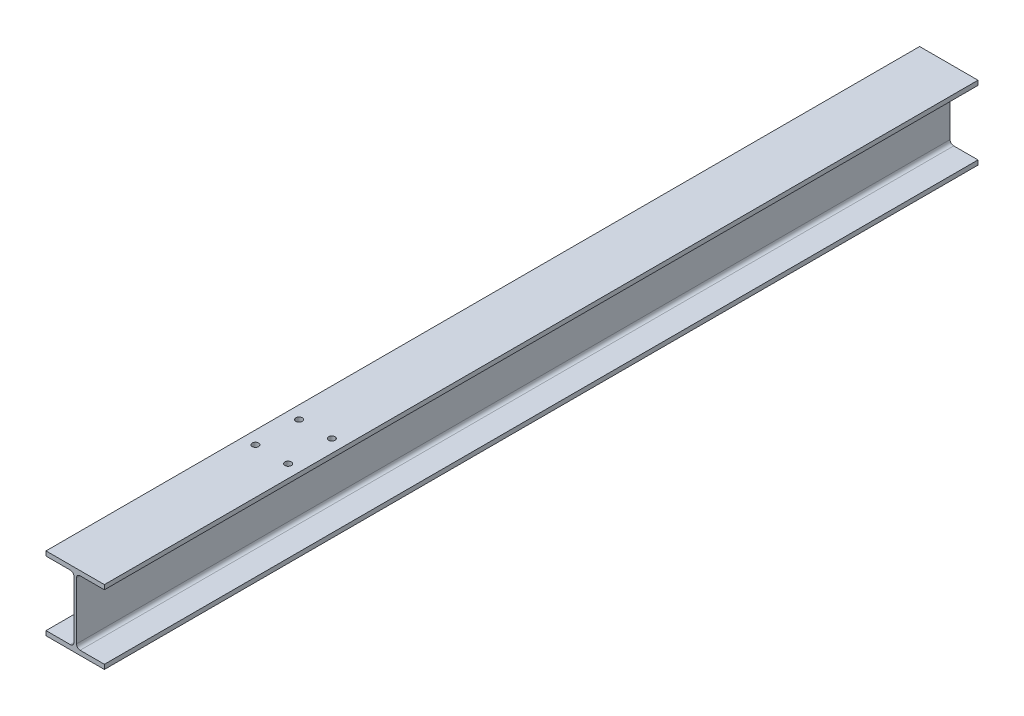
ISO-10303-21;
HEADER;
FILE_DESCRIPTION(('STEP AP214'),'2;1');
FILE_NAME('part.step','',(''),(''),'','','');
FILE_SCHEMA(('AUTOMOTIVE_DESIGN { 1 0 10303 214 1 1 1 1 }'));
ENDSEC;
DATA;
#1=APPLICATION_CONTEXT('core data for automotive mechanical design processes');
#2=APPLICATION_PROTOCOL_DEFINITION('international standard','automotive_design',2000,#1);
#3=PRODUCT_CONTEXT('',#1,'mechanical');
#4=PRODUCT('Part','Part','',(#3));
#5=PRODUCT_RELATED_PRODUCT_CATEGORY('part','',(#4));
#6=PRODUCT_DEFINITION_FORMATION('','',#4);
#7=PRODUCT_DEFINITION_CONTEXT('part definition',#1,'design');
#8=PRODUCT_DEFINITION('design','',#6,#7);
#9=PRODUCT_DEFINITION_SHAPE('','',#8);
#10=(LENGTH_UNIT() NAMED_UNIT(*) SI_UNIT(.MILLI.,.METRE.));
#11=(NAMED_UNIT(*) PLANE_ANGLE_UNIT() SI_UNIT($,.RADIAN.));
#12=(NAMED_UNIT(*) SI_UNIT($,.STERADIAN.) SOLID_ANGLE_UNIT());
#13=UNCERTAINTY_MEASURE_WITH_UNIT(LENGTH_MEASURE(1.E-05),#10,'distance_accuracy_value','');
#14=(GEOMETRIC_REPRESENTATION_CONTEXT(3) GLOBAL_UNCERTAINTY_ASSIGNED_CONTEXT((#13)) GLOBAL_UNIT_ASSIGNED_CONTEXT((#10,
#11,#12)) REPRESENTATION_CONTEXT('',''));
#15=CARTESIAN_POINT('',(0.,0.,0.));
#16=DIRECTION('',(0.,0.,1.));
#17=DIRECTION('',(1.,0.,0.));
#18=AXIS2_PLACEMENT_3D('',#15,#16,#17);
#19=CARTESIAN_POINT('',(183.500636302133,10.8236048524095,-1520.69024698075));
#20=DIRECTION('',(0.,-1.,0.));
#21=DIRECTION('',(0.,0.,-1.));
#22=AXIS2_PLACEMENT_3D('',#19,#20,#21);
#23=PLANE('',#22);
#24=DIRECTION('',(1.,0.,0.));
#25=VECTOR('',#24,1.);
#26=CARTESIAN_POINT('',(183.500636302133,10.8236048524095,1527.30975301925));
#27=LINE('',#26,#25);
#28=CARTESIAN_POINT('',(-20.207363697867,10.8236048524095,1527.30975301925));
#29=VERTEX_POINT('',#28);
#30=CARTESIAN_POINT('',(183.500636302133,10.8236048524095,1527.30975301925));
#31=VERTEX_POINT('',#30);
#32=EDGE_CURVE('E203',#29,#31,#27,.T.);
#33=ORIENTED_EDGE('',*,*,#32,.F.);
#34=DIRECTION('',(0.,0.,1.));
#35=VECTOR('',#34,1.);
#36=CARTESIAN_POINT('',(-20.207363697867,10.8236048524095,-1520.69024698075));
#37=LINE('',#36,#35);
#38=CARTESIAN_POINT('',(-20.207363697867,10.8236048524095,-1520.69024698075));
#39=VERTEX_POINT('',#38);
#40=EDGE_CURVE('E11',#39,#29,#37,.T.);
#41=ORIENTED_EDGE('',*,*,#40,.F.);
#42=DIRECTION('',(1.,0.,0.));
#43=VECTOR('',#42,1.);
#44=CARTESIAN_POINT('',(183.500636302133,10.8236048524095,-1520.69024698075));
#45=LINE('',#44,#43);
#46=CARTESIAN_POINT('',(183.500636302133,10.8236048524095,-1520.69024698075));
#47=VERTEX_POINT('',#46);
#48=EDGE_CURVE('E264',#39,#47,#45,.T.);
#49=ORIENTED_EDGE('',*,*,#48,.T.);
#50=DIRECTION('',(0.,0.,1.));
#51=VECTOR('',#50,1.);
#52=CARTESIAN_POINT('',(183.500636302133,10.8236048524095,-1520.69024698075));
#53=LINE('',#52,#51);
#54=EDGE_CURVE('E43',#47,#31,#53,.T.);
#55=ORIENTED_EDGE('',*,*,#54,.T.);
#56=EDGE_LOOP('',(#33,#41,#49,#55));
#57=FACE_BOUND('',#56,.T.);
#58=ADVANCED_FACE('F40',(#57),#23,.T.);
#59=CARTESIAN_POINT('',(-20.207363697867,10.8236048524095,-1520.69024698075));
#60=DIRECTION('',(-1.,0.,0.));
#61=DIRECTION('',(0.,-1.,0.));
#62=AXIS2_PLACEMENT_3D('',#59,#60,#61);
#63=PLANE('',#62);
#64=DIRECTION('',(0.,-1.,0.));
#65=VECTOR('',#64,1.);
#66=CARTESIAN_POINT('',(-20.207363697867,10.8236048524095,1527.30975301925));
#67=LINE('',#66,#65);
#68=CARTESIAN_POINT('',(-20.207363697867,26.5716048524095,1527.30975301925));
#69=VERTEX_POINT('',#68);
#70=EDGE_CURVE('E261',#69,#29,#67,.T.);
#71=ORIENTED_EDGE('',*,*,#70,.F.);
#72=DIRECTION('',(0.,0.,1.));
#73=VECTOR('',#72,1.);
#74=CARTESIAN_POINT('',(-20.207363697867,26.5716048524095,-1520.69024698075));
#75=LINE('',#74,#73);
#76=CARTESIAN_POINT('',(-20.207363697867,26.5716048524095,-1520.69024698075));
#77=VERTEX_POINT('',#76);
#78=EDGE_CURVE('E50',#77,#69,#75,.T.);
#79=ORIENTED_EDGE('',*,*,#78,.F.);
#80=DIRECTION('',(0.,-1.,0.));
#81=VECTOR('',#80,1.);
#82=CARTESIAN_POINT('',(-20.207363697867,10.8236048524095,-1520.69024698075));
#83=LINE('',#82,#81);
#84=EDGE_CURVE('E193',#77,#39,#83,.T.);
#85=ORIENTED_EDGE('',*,*,#84,.T.);
#86=ORIENTED_EDGE('',*,*,#40,.T.);
#87=EDGE_LOOP('',(#71,#79,#85,#86));
#88=FACE_BOUND('',#87,.T.);
#89=ADVANCED_FACE('F307',(#88),#63,.T.);
#90=CARTESIAN_POINT('',(-20.207363697867,26.5716048524095,-1520.69024698075));
#91=DIRECTION('',(0.,1.,0.));
#92=DIRECTION('',(-1.,0.,0.));
#93=AXIS2_PLACEMENT_3D('',#90,#91,#92);
#94=PLANE('',#93);
#95=DIRECTION('',(-1.,0.,0.));
#96=VECTOR('',#95,1.);
#97=CARTESIAN_POINT('',(-20.207363697867,26.5716048524095,1527.30975301925));
#98=LINE('',#97,#96);
#99=CARTESIAN_POINT('',(64.501636302133,26.5716048524095,1527.30975301925));
#100=VERTEX_POINT('',#99);
#101=EDGE_CURVE('E179',#100,#69,#98,.T.);
#102=ORIENTED_EDGE('',*,*,#101,.F.);
#103=DIRECTION('',(0.,0.,1.));
#104=VECTOR('',#103,1.);
#105=CARTESIAN_POINT('',(64.501636302133,26.5716048524095,-1520.69024698075));
#106=LINE('',#105,#104);
#107=CARTESIAN_POINT('',(64.501636302133,26.5716048524095,-1520.69024698075));
#108=VERTEX_POINT('',#107);
#109=EDGE_CURVE('E174',#108,#100,#106,.T.);
#110=ORIENTED_EDGE('',*,*,#109,.F.);
#111=DIRECTION('',(-1.,0.,0.));
#112=VECTOR('',#111,1.);
#113=CARTESIAN_POINT('',(-20.207363697867,26.5716048524095,-1520.69024698075));
#114=LINE('',#113,#112);
#115=EDGE_CURVE('E177',#108,#77,#114,.T.);
#116=ORIENTED_EDGE('',*,*,#115,.T.);
#117=ORIENTED_EDGE('',*,*,#78,.T.);
#118=EDGE_LOOP('',(#102,#110,#116,#117));
#119=FACE_BOUND('',#118,.T.);
#120=ADVANCED_FACE('F176',(#119),#94,.T.);
#121=CARTESIAN_POINT('',(64.501636302133,39.2716048524095,-1520.69024698075));
#122=DIRECTION('',(0.,0.,1.));
#123=DIRECTION('',(1.,0.,0.));
#124=AXIS2_PLACEMENT_3D('',#121,#122,#123);
#125=CYLINDRICAL_SURFACE('',#124,12.7);
#126=CARTESIAN_POINT('',(64.501636302133,39.2716048524095,1527.30975301925));
#127=DIRECTION('',(0.,0.,-1.));
#128=DIRECTION('',(1.,0.,0.));
#129=AXIS2_PLACEMENT_3D('',#126,#127,#128);
#130=CIRCLE('',#129,12.7);
#131=CARTESIAN_POINT('',(77.201636302133,39.2716048524095,1527.30975301925));
#132=VERTEX_POINT('',#131);
#133=EDGE_CURVE('E256',#132,#100,#130,.T.);
#134=ORIENTED_EDGE('',*,*,#133,.F.);
#135=DIRECTION('',(0.,0.,1.));
#136=VECTOR('',#135,1.);
#137=CARTESIAN_POINT('',(77.201636302133,39.2716048524095,-1520.69024698075));
#138=LINE('',#137,#136);
#139=CARTESIAN_POINT('',(77.201636302133,39.2716048524095,-1520.69024698075));
#140=VERTEX_POINT('',#139);
#141=EDGE_CURVE('E185',#140,#132,#138,.T.);
#142=ORIENTED_EDGE('',*,*,#141,.F.);
#143=CARTESIAN_POINT('',(64.501636302133,39.2716048524095,-1520.69024698075));
#144=DIRECTION('',(0.,0.,-1.));
#145=DIRECTION('',(1.,0.,0.));
#146=AXIS2_PLACEMENT_3D('',#143,#144,#145);
#147=CIRCLE('',#146,12.7);
#148=EDGE_CURVE('E191',#140,#108,#147,.T.);
#149=ORIENTED_EDGE('',*,*,#148,.T.);
#150=ORIENTED_EDGE('',*,*,#109,.T.);
#151=EDGE_LOOP('',(#134,#142,#149,#150));
#152=FACE_BOUND('',#151,.T.);
#153=ADVANCED_FACE('F195',(#152),#125,.F.);
#154=CARTESIAN_POINT('',(77.201636302133,39.2716048524095,-1520.69024698075));
#155=DIRECTION('',(-1.,0.,0.));
#156=DIRECTION('',(0.,-1.,0.));
#157=AXIS2_PLACEMENT_3D('',#154,#155,#156);
#158=PLANE('',#157);
#159=DIRECTION('',(0.,-1.,0.));
#160=VECTOR('',#159,1.);
#161=CARTESIAN_POINT('',(77.201636302133,39.2716048524095,1527.30975301925));
#162=LINE('',#161,#160);
#163=CARTESIAN_POINT('',(77.2016363021329,238.91560485241,1527.30975301925));
#164=VERTEX_POINT('',#163);
#165=EDGE_CURVE('E252',#164,#132,#162,.T.);
#166=ORIENTED_EDGE('',*,*,#165,.F.);
#167=DIRECTION('',(0.,0.,1.));
#168=VECTOR('',#167,1.);
#169=CARTESIAN_POINT('',(77.2016363021329,238.91560485241,-1520.69024698075));
#170=LINE('',#169,#168);
#171=CARTESIAN_POINT('',(77.2016363021329,238.91560485241,-1520.69024698075));
#172=VERTEX_POINT('',#171);
#173=EDGE_CURVE('E270',#172,#164,#170,.T.);
#174=ORIENTED_EDGE('',*,*,#173,.F.);
#175=DIRECTION('',(0.,-1.,0.));
#176=VECTOR('',#175,1.);
#177=CARTESIAN_POINT('',(77.201636302133,39.2716048524095,-1520.69024698075));
#178=LINE('',#177,#176);
#179=EDGE_CURVE('E196',#172,#140,#178,.T.);
#180=ORIENTED_EDGE('',*,*,#179,.T.);
#181=ORIENTED_EDGE('',*,*,#141,.T.);
#182=EDGE_LOOP('',(#166,#174,#180,#181));
#183=FACE_BOUND('',#182,.T.);
#184=ADVANCED_FACE('F322',(#183),#158,.T.);
#185=CARTESIAN_POINT('',(64.5016363021329,238.91560485241,-1520.69024698075));
#186=DIRECTION('',(0.,0.,1.));
#187=DIRECTION('',(1.,0.,0.));
#188=AXIS2_PLACEMENT_3D('',#185,#186,#187);
#189=CYLINDRICAL_SURFACE('',#188,12.7);
#190=CARTESIAN_POINT('',(64.5016363021329,238.91560485241,1527.30975301925));
#191=DIRECTION('',(0.,0.,-1.));
#192=DIRECTION('',(1.,0.,0.));
#193=AXIS2_PLACEMENT_3D('',#190,#191,#192);
#194=CIRCLE('',#193,12.7);
#195=CARTESIAN_POINT('',(64.5016363021329,251.61560485241,1527.30975301925));
#196=VERTEX_POINT('',#195);
#197=EDGE_CURVE('E248',#196,#164,#194,.T.);
#198=ORIENTED_EDGE('',*,*,#197,.F.);
#199=DIRECTION('',(0.,0.,1.));
#200=VECTOR('',#199,1.);
#201=CARTESIAN_POINT('',(64.5016363021329,251.61560485241,-1520.69024698075));
#202=LINE('',#201,#200);
#203=CARTESIAN_POINT('',(64.5016363021329,251.61560485241,-1520.69024698075));
#204=VERTEX_POINT('',#203);
#205=EDGE_CURVE('E273',#204,#196,#202,.T.);
#206=ORIENTED_EDGE('',*,*,#205,.F.);
#207=CARTESIAN_POINT('',(64.5016363021329,238.91560485241,-1520.69024698075));
#208=DIRECTION('',(0.,0.,-1.));
#209=DIRECTION('',(1.,0.,0.));
#210=AXIS2_PLACEMENT_3D('',#207,#208,#209);
#211=CIRCLE('',#210,12.7);
#212=EDGE_CURVE('E198',#204,#172,#211,.T.);
#213=ORIENTED_EDGE('',*,*,#212,.T.);
#214=ORIENTED_EDGE('',*,*,#173,.T.);
#215=EDGE_LOOP('',(#198,#206,#213,#214));
#216=FACE_BOUND('',#215,.T.);
#217=ADVANCED_FACE('F325',(#216),#189,.F.);
#218=CARTESIAN_POINT('',(64.5016363021329,251.61560485241,-1520.69024698075));
#219=DIRECTION('',(0.,-1.,0.));
#220=DIRECTION('',(0.,0.,-1.));
#221=AXIS2_PLACEMENT_3D('',#218,#219,#220);
#222=PLANE('',#221);
#223=CARTESIAN_POINT('',(24.496636302133,251.61560485241,841.509753019248));
#224=DIRECTION('',(0.,-1.,0.));
#225=DIRECTION('',(0.,0.,-1.));
#226=AXIS2_PLACEMENT_3D('',#223,#224,#225);
#227=CIRCLE('',#226,11.1125);
#228=CARTESIAN_POINT('',(24.496636302133,251.61560485241,830.397253019248));
#229=VERTEX_POINT('',#228);
#230=EDGE_CURVE('E393',#229,#229,#227,.F.);
#231=ORIENTED_EDGE('',*,*,#230,.T.);
#232=EDGE_LOOP('',(#231));
#233=FACE_BOUND('',#232,.T.);
#234=CARTESIAN_POINT('',(24.4966363021329,251.61560485241,689.109753019248));
#235=DIRECTION('',(0.,-1.,0.));
#236=DIRECTION('',(0.,0.,-1.));
#237=AXIS2_PLACEMENT_3D('',#234,#235,#236);
#238=CIRCLE('',#237,11.1125);
#239=CARTESIAN_POINT('',(24.4966363021329,251.61560485241,677.997253019248));
#240=VERTEX_POINT('',#239);
#241=EDGE_CURVE('E417',#240,#240,#238,.F.);
#242=ORIENTED_EDGE('',*,*,#241,.T.);
#243=EDGE_LOOP('',(#242));
#244=FACE_BOUND('',#243,.T.);
#245=DIRECTION('',(1.,0.,0.));
#246=VECTOR('',#245,1.);
#247=CARTESIAN_POINT('',(64.5016363021329,251.61560485241,1527.30975301925));
#248=LINE('',#247,#246);
#249=CARTESIAN_POINT('',(-20.2073636978671,251.61560485241,1527.30975301925));
#250=VERTEX_POINT('',#249);
#251=EDGE_CURVE('E244',#250,#196,#248,.T.);
#252=ORIENTED_EDGE('',*,*,#251,.F.);
#253=DIRECTION('',(0.,0.,1.));
#254=VECTOR('',#253,1.);
#255=CARTESIAN_POINT('',(-20.2073636978671,251.61560485241,-1520.69024698075));
#256=LINE('',#255,#254);
#257=CARTESIAN_POINT('',(-20.2073636978671,251.61560485241,-1520.69024698075));
#258=VERTEX_POINT('',#257);
#259=EDGE_CURVE('E276',#258,#250,#256,.T.);
#260=ORIENTED_EDGE('',*,*,#259,.F.);
#261=DIRECTION('',(1.,0.,0.));
#262=VECTOR('',#261,1.);
#263=CARTESIAN_POINT('',(64.5016363021329,251.61560485241,-1520.69024698075));
#264=LINE('',#263,#262);
#265=EDGE_CURVE('E451',#258,#204,#264,.T.);
#266=ORIENTED_EDGE('',*,*,#265,.T.);
#267=ORIENTED_EDGE('',*,*,#205,.T.);
#268=EDGE_LOOP('',(#252,#260,#266,#267));
#269=FACE_BOUND('',#268,.T.);
#270=ADVANCED_FACE('F329',(#233,#244,#269),#222,.T.);
#271=CARTESIAN_POINT('',(-20.2073636978671,251.61560485241,-1520.69024698075));
#272=DIRECTION('',(-1.,0.,0.));
#273=DIRECTION('',(0.,-1.,0.));
#274=AXIS2_PLACEMENT_3D('',#271,#272,#273);
#275=PLANE('',#274);
#276=DIRECTION('',(0.,-1.,0.));
#277=VECTOR('',#276,1.);
#278=CARTESIAN_POINT('',(-20.2073636978671,251.61560485241,1527.30975301925));
#279=LINE('',#278,#277);
#280=CARTESIAN_POINT('',(-20.2073636978671,267.363604852409,1527.30975301925));
#281=VERTEX_POINT('',#280);
#282=EDGE_CURVE('E240',#281,#250,#279,.T.);
#283=ORIENTED_EDGE('',*,*,#282,.F.);
#284=DIRECTION('',(0.,0.,1.));
#285=VECTOR('',#284,1.);
#286=CARTESIAN_POINT('',(-20.2073636978671,267.363604852409,-1520.69024698075));
#287=LINE('',#286,#285);
#288=CARTESIAN_POINT('',(-20.2073636978671,267.363604852409,-1520.69024698075));
#289=VERTEX_POINT('',#288);
#290=EDGE_CURVE('E279',#289,#281,#287,.T.);
#291=ORIENTED_EDGE('',*,*,#290,.F.);
#292=DIRECTION('',(0.,-1.,0.));
#293=VECTOR('',#292,1.);
#294=CARTESIAN_POINT('',(-20.2073636978671,251.61560485241,-1520.69024698075));
#295=LINE('',#294,#293);
#296=EDGE_CURVE('E448',#289,#258,#295,.T.);
#297=ORIENTED_EDGE('',*,*,#296,.T.);
#298=ORIENTED_EDGE('',*,*,#259,.T.);
#299=EDGE_LOOP('',(#283,#291,#297,#298));
#300=FACE_BOUND('',#299,.T.);
#301=ADVANCED_FACE('F333',(#300),#275,.T.);
#302=CARTESIAN_POINT('',(-20.2073636978671,267.363604852409,-1520.69024698075));
#303=DIRECTION('',(0.,1.,0.));
#304=DIRECTION('',(0.,0.,1.));
#305=AXIS2_PLACEMENT_3D('',#302,#303,#304);
#306=PLANE('',#305);
#307=CARTESIAN_POINT('',(24.496636302133,267.363604852409,841.509753019248));
#308=DIRECTION('',(0.,1.,0.));
#309=DIRECTION('',(0.,0.,1.));
#310=AXIS2_PLACEMENT_3D('',#307,#308,#309);
#311=CIRCLE('',#310,11.1125);
#312=CARTESIAN_POINT('',(24.496636302133,267.363604852409,852.622253019248));
#313=VERTEX_POINT('',#312);
#314=EDGE_CURVE('E396',#313,#313,#311,.T.);
#315=ORIENTED_EDGE('',*,*,#314,.F.);
#316=EDGE_LOOP('',(#315));
#317=FACE_BOUND('',#316,.T.);
#318=CARTESIAN_POINT('',(138.796636302133,267.363604852409,841.509753019248));
#319=DIRECTION('',(0.,1.,0.));
#320=DIRECTION('',(0.,0.,1.));
#321=AXIS2_PLACEMENT_3D('',#318,#319,#320);
#322=CIRCLE('',#321,11.1125000000001);
#323=CARTESIAN_POINT('',(138.796636302133,267.363604852409,852.622253019248));
#324=VERTEX_POINT('',#323);
#325=EDGE_CURVE('E402',#324,#324,#322,.T.);
#326=ORIENTED_EDGE('',*,*,#325,.F.);
#327=EDGE_LOOP('',(#326));
#328=FACE_BOUND('',#327,.T.);
#329=CARTESIAN_POINT('',(138.796636302133,267.363604852409,689.109753019248));
#330=DIRECTION('',(0.,1.,0.));
#331=DIRECTION('',(0.,0.,1.));
#332=AXIS2_PLACEMENT_3D('',#329,#330,#331);
#333=CIRCLE('',#332,11.1125000000001);
#334=CARTESIAN_POINT('',(138.796636302133,267.363604852409,700.222253019248));
#335=VERTEX_POINT('',#334);
#336=EDGE_CURVE('E414',#335,#335,#333,.T.);
#337=ORIENTED_EDGE('',*,*,#336,.F.);
#338=EDGE_LOOP('',(#337));
#339=FACE_BOUND('',#338,.T.);
#340=CARTESIAN_POINT('',(24.4966363021329,267.363604852409,689.109753019248));
#341=DIRECTION('',(0.,1.,0.));
#342=DIRECTION('',(0.,0.,1.));
#343=AXIS2_PLACEMENT_3D('',#340,#341,#342);
#344=CIRCLE('',#343,11.1125);
#345=CARTESIAN_POINT('',(24.4966363021329,267.363604852409,700.222253019248));
#346=VERTEX_POINT('',#345);
#347=EDGE_CURVE('E208',#346,#346,#344,.T.);
#348=ORIENTED_EDGE('',*,*,#347,.F.);
#349=EDGE_LOOP('',(#348));
#350=FACE_BOUND('',#349,.T.);
#351=DIRECTION('',(-1.,0.,0.));
#352=VECTOR('',#351,1.);
#353=CARTESIAN_POINT('',(-20.2073636978671,267.363604852409,1527.30975301925));
#354=LINE('',#353,#352);
#355=CARTESIAN_POINT('',(183.500636302133,267.363604852409,1527.30975301925));
#356=VERTEX_POINT('',#355);
#357=EDGE_CURVE('E236',#356,#281,#354,.T.);
#358=ORIENTED_EDGE('',*,*,#357,.F.);
#359=DIRECTION('',(0.,0.,1.));
#360=VECTOR('',#359,1.);
#361=CARTESIAN_POINT('',(183.500636302133,267.363604852409,-1520.69024698075));
#362=LINE('',#361,#360);
#363=CARTESIAN_POINT('',(183.500636302133,267.363604852409,-1520.69024698075));
#364=VERTEX_POINT('',#363);
#365=EDGE_CURVE('E282',#364,#356,#362,.T.);
#366=ORIENTED_EDGE('',*,*,#365,.F.);
#367=DIRECTION('',(-1.,0.,0.));
#368=VECTOR('',#367,1.);
#369=CARTESIAN_POINT('',(-20.2073636978671,267.363604852409,-1520.69024698075));
#370=LINE('',#369,#368);
#371=EDGE_CURVE('E445',#364,#289,#370,.T.);
#372=ORIENTED_EDGE('',*,*,#371,.T.);
#373=ORIENTED_EDGE('',*,*,#290,.T.);
#374=EDGE_LOOP('',(#358,#366,#372,#373));
#375=FACE_BOUND('',#374,.T.);
#376=ADVANCED_FACE('F337',(#317,#328,#339,#350,#375),#306,.T.);
#377=CARTESIAN_POINT('',(183.500636302133,267.363604852409,-1520.69024698075));
#378=DIRECTION('',(1.,0.,0.));
#379=DIRECTION('',(0.,1.,0.));
#380=AXIS2_PLACEMENT_3D('',#377,#378,#379);
#381=PLANE('',#380);
#382=DIRECTION('',(0.,1.,0.));
#383=VECTOR('',#382,1.);
#384=CARTESIAN_POINT('',(183.500636302133,267.363604852409,1527.30975301925));
#385=LINE('',#384,#383);
#386=CARTESIAN_POINT('',(183.500636302133,251.61560485241,1527.30975301925));
#387=VERTEX_POINT('',#386);
#388=EDGE_CURVE('E232',#387,#356,#385,.T.);
#389=ORIENTED_EDGE('',*,*,#388,.F.);
#390=DIRECTION('',(0.,0.,1.));
#391=VECTOR('',#390,1.);
#392=CARTESIAN_POINT('',(183.500636302133,251.61560485241,-1520.69024698075));
#393=LINE('',#392,#391);
#394=CARTESIAN_POINT('',(183.500636302133,251.61560485241,-1520.69024698075));
#395=VERTEX_POINT('',#394);
#396=EDGE_CURVE('E285',#395,#387,#393,.T.);
#397=ORIENTED_EDGE('',*,*,#396,.F.);
#398=DIRECTION('',(0.,1.,0.));
#399=VECTOR('',#398,1.);
#400=CARTESIAN_POINT('',(183.500636302133,267.363604852409,-1520.69024698075));
#401=LINE('',#400,#399);
#402=EDGE_CURVE('E442',#395,#364,#401,.T.);
#403=ORIENTED_EDGE('',*,*,#402,.T.);
#404=ORIENTED_EDGE('',*,*,#365,.T.);
#405=EDGE_LOOP('',(#389,#397,#403,#404));
#406=FACE_BOUND('',#405,.T.);
#407=ADVANCED_FACE('F341',(#406),#381,.T.);
#408=CARTESIAN_POINT('',(183.500636302133,251.61560485241,-1520.69024698075));
#409=DIRECTION('',(0.,-1.,0.));
#410=DIRECTION('',(0.,0.,-1.));
#411=AXIS2_PLACEMENT_3D('',#408,#409,#410);
#412=PLANE('',#411);
#413=CARTESIAN_POINT('',(138.796636302133,251.61560485241,841.509753019248));
#414=DIRECTION('',(0.,-1.,0.));
#415=DIRECTION('',(0.,0.,-1.));
#416=AXIS2_PLACEMENT_3D('',#413,#414,#415);
#417=CIRCLE('',#416,11.1125000000001);
#418=CARTESIAN_POINT('',(138.796636302133,251.61560485241,830.397253019248));
#419=VERTEX_POINT('',#418);
#420=EDGE_CURVE('E398',#419,#419,#417,.F.);
#421=ORIENTED_EDGE('',*,*,#420,.T.);
#422=EDGE_LOOP('',(#421));
#423=FACE_BOUND('',#422,.T.);
#424=CARTESIAN_POINT('',(138.796636302133,251.61560485241,689.109753019248));
#425=DIRECTION('',(0.,-1.,0.));
#426=DIRECTION('',(0.,0.,-1.));
#427=AXIS2_PLACEMENT_3D('',#424,#425,#426);
#428=CIRCLE('',#427,11.1125000000001);
#429=CARTESIAN_POINT('',(138.796636302133,251.61560485241,677.997253019248));
#430=VERTEX_POINT('',#429);
#431=EDGE_CURVE('E410',#430,#430,#428,.F.);
#432=ORIENTED_EDGE('',*,*,#431,.T.);
#433=EDGE_LOOP('',(#432));
#434=FACE_BOUND('',#433,.T.);
#435=DIRECTION('',(1.,0.,0.));
#436=VECTOR('',#435,1.);
#437=CARTESIAN_POINT('',(183.500636302133,251.61560485241,1527.30975301925));
#438=LINE('',#437,#436);
#439=CARTESIAN_POINT('',(98.7916363021329,251.61560485241,1527.30975301925));
#440=VERTEX_POINT('',#439);
#441=EDGE_CURVE('E228',#440,#387,#438,.T.);
#442=ORIENTED_EDGE('',*,*,#441,.F.);
#443=DIRECTION('',(0.,0.,1.));
#444=VECTOR('',#443,1.);
#445=CARTESIAN_POINT('',(98.7916363021329,251.61560485241,-1520.69024698075));
#446=LINE('',#445,#444);
#447=CARTESIAN_POINT('',(98.7916363021329,251.61560485241,-1520.69024698075));
#448=VERTEX_POINT('',#447);
#449=EDGE_CURVE('E288',#448,#440,#446,.T.);
#450=ORIENTED_EDGE('',*,*,#449,.F.);
#451=DIRECTION('',(1.,0.,0.));
#452=VECTOR('',#451,1.);
#453=CARTESIAN_POINT('',(183.500636302133,251.61560485241,-1520.69024698075));
#454=LINE('',#453,#452);
#455=EDGE_CURVE('E439',#448,#395,#454,.T.);
#456=ORIENTED_EDGE('',*,*,#455,.T.);
#457=ORIENTED_EDGE('',*,*,#396,.T.);
#458=EDGE_LOOP('',(#442,#450,#456,#457));
#459=FACE_BOUND('',#458,.T.);
#460=ADVANCED_FACE('F345',(#423,#434,#459),#412,.T.);
#461=CARTESIAN_POINT('',(98.7916363021329,238.91560485241,-1520.69024698075));
#462=DIRECTION('',(0.,0.,1.));
#463=DIRECTION('',(1.,0.,0.));
#464=AXIS2_PLACEMENT_3D('',#461,#462,#463);
#465=CYLINDRICAL_SURFACE('',#464,12.7);
#466=CARTESIAN_POINT('',(98.7916363021329,238.91560485241,1527.30975301925));
#467=DIRECTION('',(0.,0.,-1.));
#468=DIRECTION('',(1.,0.,0.));
#469=AXIS2_PLACEMENT_3D('',#466,#467,#468);
#470=CIRCLE('',#469,12.7);
#471=CARTESIAN_POINT('',(86.0916363021329,238.91560485241,1527.30975301925));
#472=VERTEX_POINT('',#471);
#473=EDGE_CURVE('E224',#472,#440,#470,.T.);
#474=ORIENTED_EDGE('',*,*,#473,.F.);
#475=DIRECTION('',(0.,0.,1.));
#476=VECTOR('',#475,1.);
#477=CARTESIAN_POINT('',(86.0916363021329,238.91560485241,-1520.69024698075));
#478=LINE('',#477,#476);
#479=CARTESIAN_POINT('',(86.0916363021329,238.91560485241,-1520.69024698075));
#480=VERTEX_POINT('',#479);
#481=EDGE_CURVE('E291',#480,#472,#478,.T.);
#482=ORIENTED_EDGE('',*,*,#481,.F.);
#483=CARTESIAN_POINT('',(98.7916363021329,238.91560485241,-1520.69024698075));
#484=DIRECTION('',(0.,0.,-1.));
#485=DIRECTION('',(1.,0.,0.));
#486=AXIS2_PLACEMENT_3D('',#483,#484,#485);
#487=CIRCLE('',#486,12.7);
#488=EDGE_CURVE('E436',#480,#448,#487,.T.);
#489=ORIENTED_EDGE('',*,*,#488,.T.);
#490=ORIENTED_EDGE('',*,*,#449,.T.);
#491=EDGE_LOOP('',(#474,#482,#489,#490));
#492=FACE_BOUND('',#491,.T.);
#493=ADVANCED_FACE('F349',(#492),#465,.F.);
#494=CARTESIAN_POINT('',(86.0916363021329,238.91560485241,-1520.69024698075));
#495=DIRECTION('',(1.,0.,0.));
#496=DIRECTION('',(0.,1.,0.));
#497=AXIS2_PLACEMENT_3D('',#494,#495,#496);
#498=PLANE('',#497);
#499=DIRECTION('',(0.,1.,0.));
#500=VECTOR('',#499,1.);
#501=CARTESIAN_POINT('',(86.0916363021329,238.91560485241,1527.30975301925));
#502=LINE('',#501,#500);
#503=CARTESIAN_POINT('',(86.0916363021329,39.2716048524095,1527.30975301925));
#504=VERTEX_POINT('',#503);
#505=EDGE_CURVE('E220',#504,#472,#502,.T.);
#506=ORIENTED_EDGE('',*,*,#505,.F.);
#507=DIRECTION('',(0.,0.,1.));
#508=VECTOR('',#507,1.);
#509=CARTESIAN_POINT('',(86.0916363021329,39.2716048524095,-1520.69024698075));
#510=LINE('',#509,#508);
#511=CARTESIAN_POINT('',(86.0916363021329,39.2716048524095,-1520.69024698075));
#512=VERTEX_POINT('',#511);
#513=EDGE_CURVE('E294',#512,#504,#510,.T.);
#514=ORIENTED_EDGE('',*,*,#513,.F.);
#515=DIRECTION('',(0.,1.,0.));
#516=VECTOR('',#515,1.);
#517=CARTESIAN_POINT('',(86.0916363021329,238.91560485241,-1520.69024698075));
#518=LINE('',#517,#516);
#519=EDGE_CURVE('E433',#512,#480,#518,.T.);
#520=ORIENTED_EDGE('',*,*,#519,.T.);
#521=ORIENTED_EDGE('',*,*,#481,.T.);
#522=EDGE_LOOP('',(#506,#514,#520,#521));
#523=FACE_BOUND('',#522,.T.);
#524=ADVANCED_FACE('F353',(#523),#498,.T.);
#525=CARTESIAN_POINT('',(98.7916363021329,39.2716048524095,-1520.69024698075));
#526=DIRECTION('',(0.,0.,1.));
#527=DIRECTION('',(1.,0.,0.));
#528=AXIS2_PLACEMENT_3D('',#525,#526,#527);
#529=CYLINDRICAL_SURFACE('',#528,12.7);
#530=CARTESIAN_POINT('',(98.7916363021329,39.2716048524095,1527.30975301925));
#531=DIRECTION('',(0.,0.,-1.));
#532=DIRECTION('',(1.,0.,0.));
#533=AXIS2_PLACEMENT_3D('',#530,#531,#532);
#534=CIRCLE('',#533,12.7);
#535=CARTESIAN_POINT('',(98.7916363021329,26.5716048524095,1527.30975301925));
#536=VERTEX_POINT('',#535);
#537=EDGE_CURVE('E216',#536,#504,#534,.T.);
#538=ORIENTED_EDGE('',*,*,#537,.F.);
#539=DIRECTION('',(0.,0.,1.));
#540=VECTOR('',#539,1.);
#541=CARTESIAN_POINT('',(98.7916363021329,26.5716048524095,-1520.69024698075));
#542=LINE('',#541,#540);
#543=CARTESIAN_POINT('',(98.7916363021329,26.5716048524095,-1520.69024698075));
#544=VERTEX_POINT('',#543);
#545=EDGE_CURVE('E297',#544,#536,#542,.T.);
#546=ORIENTED_EDGE('',*,*,#545,.F.);
#547=CARTESIAN_POINT('',(98.7916363021329,39.2716048524095,-1520.69024698075));
#548=DIRECTION('',(0.,0.,-1.));
#549=DIRECTION('',(1.,0.,0.));
#550=AXIS2_PLACEMENT_3D('',#547,#548,#549);
#551=CIRCLE('',#550,12.7);
#552=EDGE_CURVE('E430',#544,#512,#551,.T.);
#553=ORIENTED_EDGE('',*,*,#552,.T.);
#554=ORIENTED_EDGE('',*,*,#513,.T.);
#555=EDGE_LOOP('',(#538,#546,#553,#554));
#556=FACE_BOUND('',#555,.T.);
#557=ADVANCED_FACE('F357',(#556),#529,.F.);
#558=CARTESIAN_POINT('',(98.7916363021329,26.5716048524095,-1520.69024698075));
#559=DIRECTION('',(0.,1.,0.));
#560=DIRECTION('',(-1.,0.,0.));
#561=AXIS2_PLACEMENT_3D('',#558,#559,#560);
#562=PLANE('',#561);
#563=DIRECTION('',(-1.,0.,0.));
#564=VECTOR('',#563,1.);
#565=CARTESIAN_POINT('',(98.7916363021329,26.5716048524095,1527.30975301925));
#566=LINE('',#565,#564);
#567=CARTESIAN_POINT('',(183.500636302133,26.5716048524095,1527.30975301925));
#568=VERTEX_POINT('',#567);
#569=EDGE_CURVE('E212',#568,#536,#566,.T.);
#570=ORIENTED_EDGE('',*,*,#569,.F.);
#571=DIRECTION('',(0.,0.,1.));
#572=VECTOR('',#571,1.);
#573=CARTESIAN_POINT('',(183.500636302133,26.5716048524095,-1520.69024698075));
#574=LINE('',#573,#572);
#575=CARTESIAN_POINT('',(183.500636302133,26.5716048524095,-1520.69024698075));
#576=VERTEX_POINT('',#575);
#577=EDGE_CURVE('E299',#576,#568,#574,.T.);
#578=ORIENTED_EDGE('',*,*,#577,.F.);
#579=DIRECTION('',(-1.,0.,0.));
#580=VECTOR('',#579,1.);
#581=CARTESIAN_POINT('',(98.7916363021329,26.5716048524095,-1520.69024698075));
#582=LINE('',#581,#580);
#583=EDGE_CURVE('E427',#576,#544,#582,.T.);
#584=ORIENTED_EDGE('',*,*,#583,.T.);
#585=ORIENTED_EDGE('',*,*,#545,.T.);
#586=EDGE_LOOP('',(#570,#578,#584,#585));
#587=FACE_BOUND('',#586,.T.);
#588=ADVANCED_FACE('F361',(#587),#562,.T.);
#589=CARTESIAN_POINT('',(183.500636302133,26.5716048524095,-1520.69024698075));
#590=DIRECTION('',(1.,0.,0.));
#591=DIRECTION('',(0.,0.,-1.));
#592=AXIS2_PLACEMENT_3D('',#589,#590,#591);
#593=PLANE('',#592);
#594=DIRECTION('',(0.,1.,0.));
#595=VECTOR('',#594,1.);
#596=CARTESIAN_POINT('',(183.500636302133,26.5716048524095,1527.30975301925));
#597=LINE('',#596,#595);
#598=EDGE_CURVE('E207',#31,#568,#597,.T.);
#599=ORIENTED_EDGE('',*,*,#598,.F.);
#600=ORIENTED_EDGE('',*,*,#54,.F.);
#601=DIRECTION('',(0.,1.,0.));
#602=VECTOR('',#601,1.);
#603=CARTESIAN_POINT('',(183.500636302133,26.5716048524095,-1520.69024698075));
#604=LINE('',#603,#602);
#605=EDGE_CURVE('E425',#47,#576,#604,.T.);
#606=ORIENTED_EDGE('',*,*,#605,.T.);
#607=ORIENTED_EDGE('',*,*,#577,.T.);
#608=EDGE_LOOP('',(#599,#600,#606,#607));
#609=FACE_BOUND('',#608,.T.);
#610=ADVANCED_FACE('F304',(#609),#593,.T.);
#611=CARTESIAN_POINT('',(64.501636302133,39.2716048524095,-1520.69024698075));
#612=DIRECTION('',(0.,0.,1.));
#613=DIRECTION('',(1.,0.,0.));
#614=AXIS2_PLACEMENT_3D('',#611,#612,#613);
#615=PLANE('',#614);
#616=ORIENTED_EDGE('',*,*,#48,.F.);
#617=ORIENTED_EDGE('',*,*,#84,.F.);
#618=ORIENTED_EDGE('',*,*,#115,.F.);
#619=ORIENTED_EDGE('',*,*,#148,.F.);
#620=ORIENTED_EDGE('',*,*,#179,.F.);
#621=ORIENTED_EDGE('',*,*,#212,.F.);
#622=ORIENTED_EDGE('',*,*,#265,.F.);
#623=ORIENTED_EDGE('',*,*,#296,.F.);
#624=ORIENTED_EDGE('',*,*,#371,.F.);
#625=ORIENTED_EDGE('',*,*,#402,.F.);
#626=ORIENTED_EDGE('',*,*,#455,.F.);
#627=ORIENTED_EDGE('',*,*,#488,.F.);
#628=ORIENTED_EDGE('',*,*,#519,.F.);
#629=ORIENTED_EDGE('',*,*,#552,.F.);
#630=ORIENTED_EDGE('',*,*,#583,.F.);
#631=ORIENTED_EDGE('',*,*,#605,.F.);
#632=EDGE_LOOP('',(#616,#617,#618,#619,#620,#621,#622,#623,#624,#625,#626,#627,#628,#629,#630,#631));
#633=FACE_BOUND('',#632,.T.);
#634=ADVANCED_FACE('F189',(#633),#615,.F.);
#635=CARTESIAN_POINT('',(64.501636302133,39.2716048524095,1527.30975301925));
#636=DIRECTION('',(0.,0.,1.));
#637=DIRECTION('',(1.,0.,0.));
#638=AXIS2_PLACEMENT_3D('',#635,#636,#637);
#639=PLANE('',#638);
#640=ORIENTED_EDGE('',*,*,#32,.T.);
#641=ORIENTED_EDGE('',*,*,#598,.T.);
#642=ORIENTED_EDGE('',*,*,#569,.T.);
#643=ORIENTED_EDGE('',*,*,#537,.T.);
#644=ORIENTED_EDGE('',*,*,#505,.T.);
#645=ORIENTED_EDGE('',*,*,#473,.T.);
#646=ORIENTED_EDGE('',*,*,#441,.T.);
#647=ORIENTED_EDGE('',*,*,#388,.T.);
#648=ORIENTED_EDGE('',*,*,#357,.T.);
#649=ORIENTED_EDGE('',*,*,#282,.T.);
#650=ORIENTED_EDGE('',*,*,#251,.T.);
#651=ORIENTED_EDGE('',*,*,#197,.T.);
#652=ORIENTED_EDGE('',*,*,#165,.T.);
#653=ORIENTED_EDGE('',*,*,#133,.T.);
#654=ORIENTED_EDGE('',*,*,#101,.T.);
#655=ORIENTED_EDGE('',*,*,#70,.T.);
#656=EDGE_LOOP('',(#640,#641,#642,#643,#644,#645,#646,#647,#648,#649,#650,#651,#652,#653,#654,#655));
#657=FACE_BOUND('',#656,.T.);
#658=ADVANCED_FACE('F306',(#657),#639,.T.);
#659=CARTESIAN_POINT('',(24.4966363021329,10.8226048524095,689.109753019248));
#660=DIRECTION('',(0.,1.,0.));
#661=DIRECTION('',(0.,0.,1.));
#662=AXIS2_PLACEMENT_3D('',#659,#660,#661);
#663=CYLINDRICAL_SURFACE('',#662,11.1125);
#664=ORIENTED_EDGE('',*,*,#241,.F.);
#665=EDGE_LOOP('',(#664));
#666=FACE_BOUND('',#665,.T.);
#667=ORIENTED_EDGE('',*,*,#347,.T.);
#668=EDGE_LOOP('',(#667));
#669=FACE_BOUND('',#668,.T.);
#670=ADVANCED_FACE('F372',(#666,#669),#663,.F.);
#671=CARTESIAN_POINT('',(138.796636302133,10.8226048524095,689.109753019248));
#672=DIRECTION('',(0.,1.,0.));
#673=DIRECTION('',(0.,0.,1.));
#674=AXIS2_PLACEMENT_3D('',#671,#672,#673);
#675=CYLINDRICAL_SURFACE('',#674,11.1125000000001);
#676=ORIENTED_EDGE('',*,*,#431,.F.);
#677=EDGE_LOOP('',(#676));
#678=FACE_BOUND('',#677,.T.);
#679=ORIENTED_EDGE('',*,*,#336,.T.);
#680=EDGE_LOOP('',(#679));
#681=FACE_BOUND('',#680,.T.);
#682=ADVANCED_FACE('F376',(#678,#681),#675,.F.);
#683=CARTESIAN_POINT('',(138.796636302133,10.8226048524095,841.509753019248));
#684=DIRECTION('',(0.,1.,0.));
#685=DIRECTION('',(0.,0.,1.));
#686=AXIS2_PLACEMENT_3D('',#683,#684,#685);
#687=CYLINDRICAL_SURFACE('',#686,11.1125000000001);
#688=ORIENTED_EDGE('',*,*,#420,.F.);
#689=EDGE_LOOP('',(#688));
#690=FACE_BOUND('',#689,.T.);
#691=ORIENTED_EDGE('',*,*,#325,.T.);
#692=EDGE_LOOP('',(#691));
#693=FACE_BOUND('',#692,.T.);
#694=ADVANCED_FACE('F380',(#690,#693),#687,.F.);
#695=CARTESIAN_POINT('',(24.496636302133,10.8226048524095,841.509753019248));
#696=DIRECTION('',(0.,1.,0.));
#697=DIRECTION('',(0.,0.,1.));
#698=AXIS2_PLACEMENT_3D('',#695,#696,#697);
#699=CYLINDRICAL_SURFACE('',#698,11.1125);
#700=ORIENTED_EDGE('',*,*,#230,.F.);
#701=EDGE_LOOP('',(#700));
#702=FACE_BOUND('',#701,.T.);
#703=ORIENTED_EDGE('',*,*,#314,.T.);
#704=EDGE_LOOP('',(#703));
#705=FACE_BOUND('',#704,.T.);
#706=ADVANCED_FACE('F384',(#702,#705),#699,.F.);
#707=CLOSED_SHELL('',(#58,#89,#120,#153,#184,#217,#270,#301,#376,#407,#460,#493,#524,#557,#588,
#610,#634,#658,#670,#682,#694,#706));
#708=MANIFOLD_SOLID_BREP('B2',#707);
#709=ADVANCED_BREP_SHAPE_REPRESENTATION('',(#18,#708),#14);
#710=SHAPE_DEFINITION_REPRESENTATION(#9,#709);
ENDSEC;
END-ISO-10303-21;
